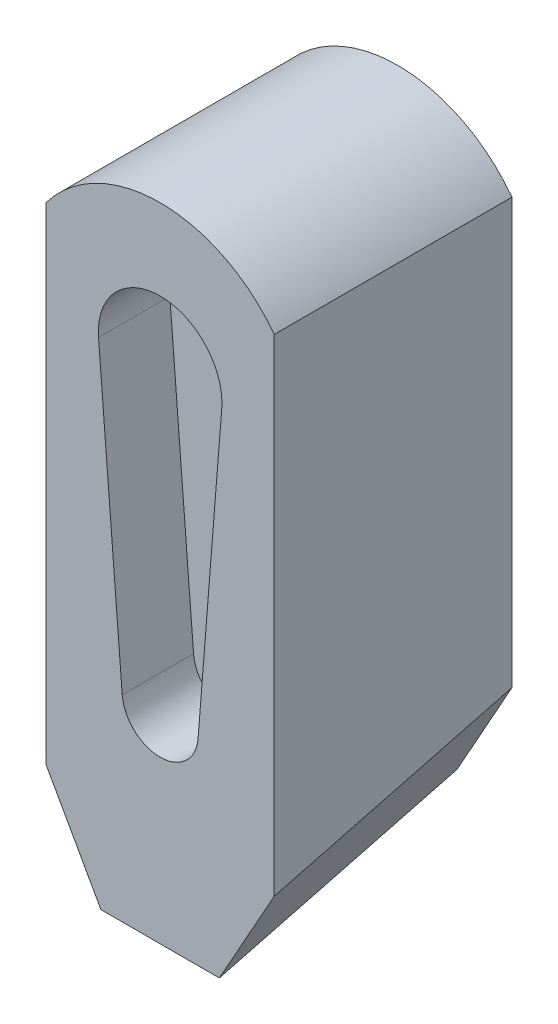
ISO-10303-21;
HEADER;
FILE_DESCRIPTION(('STEP AP214'),'2;1');
FILE_NAME('part.step','',(''),(''),'','','');
FILE_SCHEMA(('AUTOMOTIVE_DESIGN { 1 0 10303 214 1 1 1 1 }'));
ENDSEC;
DATA;
#1=APPLICATION_CONTEXT('core data for automotive mechanical design processes');
#2=APPLICATION_PROTOCOL_DEFINITION('international standard','automotive_design',2000,#1);
#3=PRODUCT_CONTEXT('',#1,'mechanical');
#4=PRODUCT('Part','Part','',(#3));
#5=PRODUCT_RELATED_PRODUCT_CATEGORY('part','',(#4));
#6=PRODUCT_DEFINITION_FORMATION('','',#4);
#7=PRODUCT_DEFINITION_CONTEXT('part definition',#1,'design');
#8=PRODUCT_DEFINITION('design','',#6,#7);
#9=PRODUCT_DEFINITION_SHAPE('','',#8);
#10=(LENGTH_UNIT() NAMED_UNIT(*) SI_UNIT(.MILLI.,.METRE.));
#11=(NAMED_UNIT(*) PLANE_ANGLE_UNIT() SI_UNIT($,.RADIAN.));
#12=(NAMED_UNIT(*) SI_UNIT($,.STERADIAN.) SOLID_ANGLE_UNIT());
#13=UNCERTAINTY_MEASURE_WITH_UNIT(LENGTH_MEASURE(1.E-05),#10,'distance_accuracy_value','');
#14=(GEOMETRIC_REPRESENTATION_CONTEXT(3) GLOBAL_UNCERTAINTY_ASSIGNED_CONTEXT((#13)) GLOBAL_UNIT_ASSIGNED_CONTEXT((#10,
#11,#12)) REPRESENTATION_CONTEXT('',''));
#15=CARTESIAN_POINT('',(0.,0.,0.));
#16=DIRECTION('',(0.,0.,1.));
#17=DIRECTION('',(1.,0.,0.));
#18=AXIS2_PLACEMENT_3D('',#15,#16,#17);
#19=CARTESIAN_POINT('',(0.,0.,0.));
#20=DIRECTION('',(0.,0.,1.));
#21=DIRECTION('',(1.,0.,0.));
#22=AXIS2_PLACEMENT_3D('',#19,#20,#21);
#23=CYLINDRICAL_SURFACE('',#22,1.5875);
#24=CARTESIAN_POINT('',(0.,0.,8.89));
#25=DIRECTION('',(0.,0.,1.));
#26=DIRECTION('',(1.,0.,0.));
#27=AXIS2_PLACEMENT_3D('',#24,#25,#26);
#28=CIRCLE('',#27,1.5875);
#29=CARTESIAN_POINT('',(1.5875,0.,8.89));
#30=VERTEX_POINT('',#29);
#31=EDGE_CURVE('E223',#30,#30,#28,.T.);
#32=CARTESIAN_POINT('',(0.,0.,6.35));
#33=DIRECTION('',(0.,0.,-1.));
#34=DIRECTION('',(-1.,0.,0.));
#35=AXIS2_PLACEMENT_3D('',#32,#33,#34);
#36=CIRCLE('',#35,1.5875);
#37=CARTESIAN_POINT('',(1.5875,0.,6.35));
#38=VERTEX_POINT('',#37);
#39=EDGE_CURVE('E219',#38,#38,#36,.F.);
#40=CARTESIAN_POINT('',(1.5875,0.,8.89));
#41=CARTESIAN_POINT('',(1.5875,0.,8.86354166666667));
#42=CARTESIAN_POINT('',(1.5875,0.,8.83708333333333));
#43=CARTESIAN_POINT('',(1.5875,0.,8.78416666666667));
#44=CARTESIAN_POINT('',(1.5875,0.,8.75770833333334));
#45=CARTESIAN_POINT('',(1.5875,0.,8.70479166666667));
#46=CARTESIAN_POINT('',(1.5875,0.,8.67833333333333));
#47=CARTESIAN_POINT('',(1.5875,0.,8.62541666666667));
#48=CARTESIAN_POINT('',(1.5875,0.,8.59895833333333));
#49=CARTESIAN_POINT('',(1.5875,0.,8.54604166666667));
#50=CARTESIAN_POINT('',(1.5875,0.,8.51958333333333));
#51=CARTESIAN_POINT('',(1.5875,0.,8.46666666666667));
#52=CARTESIAN_POINT('',(1.5875,0.,8.44020833333333));
#53=CARTESIAN_POINT('',(1.5875,0.,8.38729166666667));
#54=CARTESIAN_POINT('',(1.5875,0.,8.36083333333333));
#55=CARTESIAN_POINT('',(1.5875,0.,8.30791666666667));
#56=CARTESIAN_POINT('',(1.5875,0.,8.28145833333333));
#57=CARTESIAN_POINT('',(1.5875,0.,8.22854166666667));
#58=CARTESIAN_POINT('',(1.5875,0.,8.20208333333333));
#59=CARTESIAN_POINT('',(1.5875,0.,8.14916666666667));
#60=CARTESIAN_POINT('',(1.5875,0.,8.12270833333333));
#61=CARTESIAN_POINT('',(1.5875,0.,8.06979166666667));
#62=CARTESIAN_POINT('',(1.5875,0.,8.04333333333333));
#63=CARTESIAN_POINT('',(1.5875,0.,7.99041666666667));
#64=CARTESIAN_POINT('',(1.5875,0.,7.96395833333333));
#65=CARTESIAN_POINT('',(1.5875,0.,7.91104166666667));
#66=CARTESIAN_POINT('',(1.5875,0.,7.88458333333333));
#67=CARTESIAN_POINT('',(1.5875,0.,7.83166666666667));
#68=CARTESIAN_POINT('',(1.5875,0.,7.80520833333333));
#69=CARTESIAN_POINT('',(1.5875,0.,7.75229166666667));
#70=CARTESIAN_POINT('',(1.5875,0.,7.72583333333333));
#71=CARTESIAN_POINT('',(1.5875,0.,7.67291666666667));
#72=CARTESIAN_POINT('',(1.5875,0.,7.64645833333333));
#73=CARTESIAN_POINT('',(1.5875,0.,7.59354166666667));
#74=CARTESIAN_POINT('',(1.5875,0.,7.56708333333333));
#75=CARTESIAN_POINT('',(1.5875,0.,7.51416666666667));
#76=CARTESIAN_POINT('',(1.5875,0.,7.48770833333333));
#77=CARTESIAN_POINT('',(1.5875,0.,7.43479166666667));
#78=CARTESIAN_POINT('',(1.5875,0.,7.40833333333333));
#79=CARTESIAN_POINT('',(1.5875,0.,7.35541666666667));
#80=CARTESIAN_POINT('',(1.5875,0.,7.32895833333333));
#81=CARTESIAN_POINT('',(1.5875,0.,7.27604166666667));
#82=CARTESIAN_POINT('',(1.5875,0.,7.24958333333333));
#83=CARTESIAN_POINT('',(1.5875,0.,7.19666666666667));
#84=CARTESIAN_POINT('',(1.5875,0.,7.17020833333333));
#85=CARTESIAN_POINT('',(1.5875,0.,7.11729166666667));
#86=CARTESIAN_POINT('',(1.5875,0.,7.09083333333333));
#87=CARTESIAN_POINT('',(1.5875,0.,7.03791666666667));
#88=CARTESIAN_POINT('',(1.5875,0.,7.01145833333333));
#89=CARTESIAN_POINT('',(1.5875,0.,6.95854166666667));
#90=CARTESIAN_POINT('',(1.5875,0.,6.93208333333333));
#91=CARTESIAN_POINT('',(1.5875,0.,6.87916666666667));
#92=CARTESIAN_POINT('',(1.5875,0.,6.85270833333333));
#93=CARTESIAN_POINT('',(1.5875,0.,6.79979166666667));
#94=CARTESIAN_POINT('',(1.5875,0.,6.77333333333333));
#95=CARTESIAN_POINT('',(1.5875,0.,6.72041666666667));
#96=CARTESIAN_POINT('',(1.5875,0.,6.69395833333333));
#97=CARTESIAN_POINT('',(1.5875,0.,6.64104166666667));
#98=CARTESIAN_POINT('',(1.5875,0.,6.61458333333333));
#99=CARTESIAN_POINT('',(1.5875,0.,6.56166666666667));
#100=CARTESIAN_POINT('',(1.5875,0.,6.53520833333333));
#101=CARTESIAN_POINT('',(1.5875,0.,6.48229166666667));
#102=CARTESIAN_POINT('',(1.5875,0.,6.45583333333333));
#103=CARTESIAN_POINT('',(1.5875,0.,6.40291666666667));
#104=CARTESIAN_POINT('',(1.5875,0.,6.37645833333333));
#105=CARTESIAN_POINT('',(1.5875,0.,6.35));
#106=B_SPLINE_CURVE_WITH_KNOTS('',3,(#40,#41,#42,#43,#44,#45,#46,#47,#48,#49,#50,#51,#52,#53,
#54,#55,#56,#57,#58,#59,#60,#61,#62,#63,#64,#65,#66,#67,#68,#69,#70,#71,#72,#73,#74,#75,#76,#77,
#78,#79,#80,#81,#82,#83,#84,#85,#86,#87,#88,#89,#90,#91,#92,#93,#94,#95,#96,#97,#98,#99,#100,
#101,#102,#103,#104,#105),.UNSPECIFIED.,.F.,.F.,(4,2,2,2,2,2,2,2,2,2,2,2,2,2,2,2,2,2,2,2,2,2,2,
2,2,2,2,2,2,2,2,2,4),(0.,0.0793749999999996,0.158749999999999,0.238125,0.3175,0.396875,
0.476250000000001,0.555625000000001,0.635,0.714375,0.793749999999999,0.873125000000001,0.9525,
1.031875,1.11125,1.190625,1.27,1.349375,1.42875,1.508125,1.5875,1.666875,1.74625,1.825625,1.905,
1.984375,2.06375,2.143125,2.2225,2.301875,2.38125,2.460625,2.54),.UNSPECIFIED.);
#107=EDGE_CURVE('BSEAM47',#30,#38,#106,.T.);
#108=ORIENTED_EDGE('',*,*,#31,.T.);
#109=ORIENTED_EDGE('',*,*,#39,.F.);
#110=ORIENTED_EDGE('',*,*,#107,.T.);
#111=ORIENTED_EDGE('',*,*,#107,.F.);
#112=EDGE_LOOP('',(#108,#110,#109,#111));
#113=FACE_BOUND('',#112,.T.);
#114=ADVANCED_FACE('F47',(#113),#23,.F.);
#115=CARTESIAN_POINT('',(0.,0.,12.7));
#116=DIRECTION('',(0.,0.,-1.));
#117=DIRECTION('',(-1.,0.,0.));
#118=AXIS2_PLACEMENT_3D('',#115,#116,#117);
#119=CYLINDRICAL_SURFACE('',#118,7.62);
#120=CARTESIAN_POINT('',(0.,0.,0.));
#121=DIRECTION('',(0.,0.,1.));
#122=DIRECTION('',(-1.,0.,0.));
#123=AXIS2_PLACEMENT_3D('',#120,#121,#122);
#124=CIRCLE('',#123,7.62);
#125=CARTESIAN_POINT('',(6.096,4.57199999999999,0.));
#126=VERTEX_POINT('',#125);
#127=CARTESIAN_POINT('',(-6.096,4.57199999999999,0.));
#128=VERTEX_POINT('',#127);
#129=EDGE_CURVE('E175',#126,#128,#124,.T.);
#130=ORIENTED_EDGE('',*,*,#129,.T.);
#131=DIRECTION('',(0.,0.,-1.));
#132=VECTOR('',#131,1.);
#133=CARTESIAN_POINT('',(-6.096,4.57199999999999,12.7));
#134=LINE('',#133,#132);
#135=CARTESIAN_POINT('',(-6.096,4.57199999999999,12.7));
#136=VERTEX_POINT('',#135);
#137=EDGE_CURVE('E201',#136,#128,#134,.T.);
#138=ORIENTED_EDGE('',*,*,#137,.F.);
#139=CARTESIAN_POINT('',(0.,0.,12.7));
#140=DIRECTION('',(0.,0.,1.));
#141=DIRECTION('',(-1.,0.,0.));
#142=AXIS2_PLACEMENT_3D('',#139,#140,#141);
#143=CIRCLE('',#142,7.62);
#144=CARTESIAN_POINT('',(6.096,4.57199999999999,12.7));
#145=VERTEX_POINT('',#144);
#146=EDGE_CURVE('E176',#145,#136,#143,.T.);
#147=ORIENTED_EDGE('',*,*,#146,.F.);
#148=DIRECTION('',(0.,0.,-1.));
#149=VECTOR('',#148,1.);
#150=CARTESIAN_POINT('',(6.096,4.57199999999999,12.7));
#151=LINE('',#150,#149);
#152=EDGE_CURVE('E188',#145,#126,#151,.T.);
#153=ORIENTED_EDGE('',*,*,#152,.T.);
#154=EDGE_LOOP('',(#130,#138,#147,#153));
#155=FACE_BOUND('',#154,.T.);
#156=ADVANCED_FACE('F272',(#155),#119,.T.);
#157=CARTESIAN_POINT('',(-6.096,4.57199999999999,12.7));
#158=DIRECTION('',(1.,0.,0.));
#159=DIRECTION('',(0.,1.,0.));
#160=AXIS2_PLACEMENT_3D('',#157,#158,#159);
#161=PLANE('',#160);
#162=DIRECTION('',(0.,-1.,0.));
#163=VECTOR('',#162,1.);
#164=CARTESIAN_POINT('',(-6.096,4.57199999999999,0.));
#165=LINE('',#164,#163);
#166=CARTESIAN_POINT('',(-6.096,-18.1191036741044,0.));
#167=VERTEX_POINT('',#166);
#168=EDGE_CURVE('E192',#128,#167,#165,.T.);
#169=ORIENTED_EDGE('',*,*,#168,.T.);
#170=DIRECTION('',(0.,-0.251633851764951,0.967822506788272));
#171=VECTOR('',#170,1.);
#172=CARTESIAN_POINT('',(-6.096,-19.7752308674639,6.36971997445939));
#173=LINE('',#172,#171);
#174=CARTESIAN_POINT('',(-6.096,-21.4211036741044,12.7));
#175=VERTEX_POINT('',#174);
#176=EDGE_CURVE('E232',#167,#175,#173,.T.);
#177=ORIENTED_EDGE('',*,*,#176,.T.);
#178=DIRECTION('',(0.,-1.,0.));
#179=VECTOR('',#178,1.);
#180=CARTESIAN_POINT('',(-6.096,4.57199999999999,12.7));
#181=LINE('',#180,#179);
#182=EDGE_CURVE('E180',#136,#175,#181,.T.);
#183=ORIENTED_EDGE('',*,*,#182,.F.);
#184=ORIENTED_EDGE('',*,*,#137,.T.);
#185=EDGE_LOOP('',(#169,#177,#183,#184));
#186=FACE_BOUND('',#185,.T.);
#187=ADVANCED_FACE('F258',(#186),#161,.F.);
#188=CARTESIAN_POINT('',(6.096,-33.528,12.7));
#189=DIRECTION('',(-1.,0.,0.));
#190=DIRECTION('',(0.,-1.,0.));
#191=AXIS2_PLACEMENT_3D('',#188,#189,#190);
#192=PLANE('',#191);
#193=DIRECTION('',(0.,1.,0.));
#194=VECTOR('',#193,1.);
#195=CARTESIAN_POINT('',(6.096,-33.528,12.7));
#196=LINE('',#195,#194);
#197=CARTESIAN_POINT('',(6.096,-21.4211036741044,12.7));
#198=VERTEX_POINT('',#197);
#199=EDGE_CURVE('E185',#198,#145,#196,.T.);
#200=ORIENTED_EDGE('',*,*,#199,.F.);
#201=DIRECTION('',(0.,0.251633851764951,-0.967822506788272));
#202=VECTOR('',#201,1.);
#203=CARTESIAN_POINT('',(6.096,-22.1877074504537,15.648476062882));
#204=LINE('',#203,#202);
#205=CARTESIAN_POINT('',(6.096,-18.1191036741044,0.));
#206=VERTEX_POINT('',#205);
#207=EDGE_CURVE('E11',#198,#206,#204,.T.);
#208=ORIENTED_EDGE('',*,*,#207,.T.);
#209=DIRECTION('',(0.,1.,0.));
#210=VECTOR('',#209,1.);
#211=CARTESIAN_POINT('',(6.096,-33.528,0.));
#212=LINE('',#211,#210);
#213=EDGE_CURVE('E181',#206,#126,#212,.T.);
#214=ORIENTED_EDGE('',*,*,#213,.T.);
#215=ORIENTED_EDGE('',*,*,#152,.F.);
#216=EDGE_LOOP('',(#200,#208,#214,#215));
#217=FACE_BOUND('',#216,.T.);
#218=ADVANCED_FACE('F269',(#217),#192,.F.);
#219=CARTESIAN_POINT('',(0.,0.,12.7));
#220=DIRECTION('',(0.,0.,-1.));
#221=DIRECTION('',(-1.,0.,0.));
#222=AXIS2_PLACEMENT_3D('',#219,#220,#221);
#223=PLANE('',#222);
#224=DIRECTION('',(-0.0793650793650793,0.996845617022704,0.));
#225=VECTOR('',#224,1.);
#226=CARTESIAN_POINT('',(-2.02559029379013,-16.1632698412698,12.7));
#227=LINE('',#226,#225);
#228=CARTESIAN_POINT('',(-2.02559029379013,-16.1632698412698,12.7));
#229=VERTEX_POINT('',#228);
#230=CARTESIAN_POINT('',(-3.29158422740897,-0.262063492063492,12.7));
#231=VERTEX_POINT('',#230);
#232=EDGE_CURVE('E205',#229,#231,#227,.T.);
#233=ORIENTED_EDGE('',*,*,#232,.T.);
#234=CARTESIAN_POINT('',(0.,0.,12.7));
#235=DIRECTION('',(0.,0.,1.));
#236=DIRECTION('',(1.,0.,0.));
#237=AXIS2_PLACEMENT_3D('',#234,#235,#236);
#238=CIRCLE('',#237,3.302);
#239=CARTESIAN_POINT('',(3.29158422740897,-0.262063492063492,12.7));
#240=VERTEX_POINT('',#239);
#241=EDGE_CURVE('E134',#231,#240,#238,.F.);
#242=ORIENTED_EDGE('',*,*,#241,.T.);
#243=DIRECTION('',(-0.0793650793650794,-0.996845617022704,0.));
#244=VECTOR('',#243,1.);
#245=CARTESIAN_POINT('',(3.29158422740897,-0.26206349206349,12.7));
#246=LINE('',#245,#244);
#247=CARTESIAN_POINT('',(2.02559029379013,-16.1632698412698,12.7));
#248=VERTEX_POINT('',#247);
#249=EDGE_CURVE('E212',#240,#248,#246,.T.);
#250=ORIENTED_EDGE('',*,*,#249,.T.);
#251=CARTESIAN_POINT('',(0.,-16.002,12.7));
#252=DIRECTION('',(0.,0.,1.));
#253=DIRECTION('',(1.,0.,0.));
#254=AXIS2_PLACEMENT_3D('',#251,#252,#253);
#255=CIRCLE('',#254,2.032);
#256=EDGE_CURVE('E208',#248,#229,#255,.F.);
#257=ORIENTED_EDGE('',*,*,#256,.T.);
#258=EDGE_LOOP('',(#233,#242,#250,#257));
#259=FACE_BOUND('',#258,.T.);
#260=ORIENTED_EDGE('',*,*,#182,.T.);
#261=DIRECTION('',(-0.487787467741959,0.872962419760374,0.));
#262=VECTOR('',#261,1.);
#263=CARTESIAN_POINT('',(-6.79684576947324,-20.166844269634,12.7));
#264=LINE('',#263,#262);
#265=CARTESIAN_POINT('',(-3.16306063251672,-26.67,12.7));
#266=VERTEX_POINT('',#265);
#267=EDGE_CURVE('E239',#175,#266,#264,.F.);
#268=ORIENTED_EDGE('',*,*,#267,.T.);
#269=DIRECTION('',(1.,0.,0.));
#270=VECTOR('',#269,1.);
#271=CARTESIAN_POINT('',(-6.09600000000001,-26.67,12.7));
#272=LINE('',#271,#270);
#273=CARTESIAN_POINT('',(3.1630606325167,-26.67,12.7));
#274=VERTEX_POINT('',#273);
#275=EDGE_CURVE('E154',#266,#274,#272,.T.);
#276=ORIENTED_EDGE('',*,*,#275,.T.);
#277=DIRECTION('',(-0.487787467741959,-0.872962419760374,0.));
#278=VECTOR('',#277,1.);
#279=CARTESIAN_POINT('',(3.1630606325167,-26.67,12.7));
#280=LINE('',#279,#278);
#281=EDGE_CURVE('E236',#274,#198,#280,.F.);
#282=ORIENTED_EDGE('',*,*,#281,.T.);
#283=ORIENTED_EDGE('',*,*,#199,.T.);
#284=ORIENTED_EDGE('',*,*,#146,.T.);
#285=EDGE_LOOP('',(#260,#268,#276,#282,#283,#284));
#286=FACE_BOUND('',#285,.T.);
#287=ADVANCED_FACE('F263',(#259,#286),#223,.F.);
#288=CARTESIAN_POINT('',(0.,0.,0.));
#289=DIRECTION('',(0.,0.,-1.));
#290=DIRECTION('',(-1.,0.,0.));
#291=AXIS2_PLACEMENT_3D('',#288,#289,#290);
#292=PLANE('',#291);
#293=CARTESIAN_POINT('',(0.,0.,0.));
#294=DIRECTION('',(0.,0.,-1.));
#295=DIRECTION('',(-1.,0.,0.));
#296=AXIS2_PLACEMENT_3D('',#293,#294,#295);
#297=CIRCLE('',#296,3.175);
#298=CARTESIAN_POINT('',(-3.175,0.,0.));
#299=VERTEX_POINT('',#298);
#300=EDGE_CURVE('E224',#299,#299,#297,.T.);
#301=ORIENTED_EDGE('',*,*,#300,.F.);
#302=EDGE_LOOP('',(#301));
#303=FACE_BOUND('',#302,.T.);
#304=DIRECTION('',(1.,0.,0.));
#305=VECTOR('',#304,1.);
#306=CARTESIAN_POINT('',(-6.09600000000001,-23.368,0.));
#307=LINE('',#306,#305);
#308=CARTESIAN_POINT('',(-3.16306063251672,-23.368,0.));
#309=VERTEX_POINT('',#308);
#310=CARTESIAN_POINT('',(3.1630606325167,-23.368,0.));
#311=VERTEX_POINT('',#310);
#312=EDGE_CURVE('E158',#309,#311,#307,.T.);
#313=ORIENTED_EDGE('',*,*,#312,.F.);
#314=DIRECTION('',(0.487787467741959,-0.872962419760374,0.));
#315=VECTOR('',#314,1.);
#316=CARTESIAN_POINT('',(-12.3610174517805,-6.90699767256105,0.));
#317=LINE('',#316,#315);
#318=EDGE_CURVE('E57',#309,#167,#317,.F.);
#319=ORIENTED_EDGE('',*,*,#318,.T.);
#320=ORIENTED_EDGE('',*,*,#168,.F.);
#321=ORIENTED_EDGE('',*,*,#129,.F.);
#322=ORIENTED_EDGE('',*,*,#213,.F.);
#323=DIRECTION('',(0.487787467741959,0.872962419760374,0.));
#324=VECTOR('',#323,1.);
#325=CARTESIAN_POINT('',(12.3610174517805,-6.90699767256104,0.));
#326=LINE('',#325,#324);
#327=EDGE_CURVE('E69',#206,#311,#326,.F.);
#328=ORIENTED_EDGE('',*,*,#327,.T.);
#329=EDGE_LOOP('',(#313,#319,#320,#321,#322,#328));
#330=FACE_BOUND('',#329,.T.);
#331=ADVANCED_FACE('F252',(#303,#330),#292,.T.);
#332=CARTESIAN_POINT('',(0.,0.,8.89));
#333=DIRECTION('',(0.,0.,1.));
#334=DIRECTION('',(1.,0.,0.));
#335=AXIS2_PLACEMENT_3D('',#332,#333,#334);
#336=CYLINDRICAL_SURFACE('',#335,3.302);
#337=DIRECTION('',(0.,0.,1.));
#338=VECTOR('',#337,1.);
#339=CARTESIAN_POINT('',(-3.29158422740897,-0.262063492063492,8.89));
#340=LINE('',#339,#338);
#341=CARTESIAN_POINT('',(-3.29158422740897,-0.262063492063492,8.89));
#342=VERTEX_POINT('',#341);
#343=EDGE_CURVE('E126',#342,#231,#340,.T.);
#344=ORIENTED_EDGE('',*,*,#343,.F.);
#345=CARTESIAN_POINT('',(0.,0.,8.89));
#346=DIRECTION('',(0.,0.,1.));
#347=DIRECTION('',(1.,0.,0.));
#348=AXIS2_PLACEMENT_3D('',#345,#346,#347);
#349=CIRCLE('',#348,3.302);
#350=CARTESIAN_POINT('',(3.29158422740897,-0.262063492063492,8.89));
#351=VERTEX_POINT('',#350);
#352=EDGE_CURVE('E131',#351,#342,#349,.T.);
#353=ORIENTED_EDGE('',*,*,#352,.F.);
#354=DIRECTION('',(0.,0.,1.));
#355=VECTOR('',#354,1.);
#356=CARTESIAN_POINT('',(3.29158422740897,-0.262063492063492,8.89));
#357=LINE('',#356,#355);
#358=EDGE_CURVE('E172',#351,#240,#357,.T.);
#359=ORIENTED_EDGE('',*,*,#358,.T.);
#360=ORIENTED_EDGE('',*,*,#241,.F.);
#361=EDGE_LOOP('',(#344,#353,#359,#360));
#362=FACE_BOUND('',#361,.T.);
#363=ADVANCED_FACE('F128',(#362),#336,.F.);
#364=CARTESIAN_POINT('',(3.29158422740897,-0.262063492063492,8.89));
#365=DIRECTION('',(0.996845617022703,-0.0793650793650793,0.));
#366=DIRECTION('',(0.0793650793650794,0.996845617022704,0.));
#367=AXIS2_PLACEMENT_3D('',#364,#365,#366);
#368=PLANE('',#367);
#369=ORIENTED_EDGE('',*,*,#358,.F.);
#370=DIRECTION('',(0.0793650793650793,0.996845617022704,0.));
#371=VECTOR('',#370,1.);
#372=CARTESIAN_POINT('',(3.29158422740897,-0.262063492063492,8.89));
#373=LINE('',#372,#371);
#374=CARTESIAN_POINT('',(2.02559029379013,-16.1632698412698,8.89));
#375=VERTEX_POINT('',#374);
#376=EDGE_CURVE('E139',#375,#351,#373,.T.);
#377=ORIENTED_EDGE('',*,*,#376,.F.);
#378=DIRECTION('',(0.,0.,1.));
#379=VECTOR('',#378,1.);
#380=CARTESIAN_POINT('',(2.02559029379013,-16.1632698412698,8.89));
#381=LINE('',#380,#379);
#382=EDGE_CURVE('E168',#375,#248,#381,.T.);
#383=ORIENTED_EDGE('',*,*,#382,.T.);
#384=ORIENTED_EDGE('',*,*,#249,.F.);
#385=EDGE_LOOP('',(#369,#377,#383,#384));
#386=FACE_BOUND('',#385,.T.);
#387=ADVANCED_FACE('F372',(#386),#368,.F.);
#388=CARTESIAN_POINT('',(0.,-16.002,8.89));
#389=DIRECTION('',(0.,0.,1.));
#390=DIRECTION('',(1.,0.,0.));
#391=AXIS2_PLACEMENT_3D('',#388,#389,#390);
#392=CYLINDRICAL_SURFACE('',#391,2.032);
#393=ORIENTED_EDGE('',*,*,#382,.F.);
#394=CARTESIAN_POINT('',(0.,-16.002,8.89));
#395=DIRECTION('',(0.,0.,1.));
#396=DIRECTION('',(-1.,0.,0.));
#397=AXIS2_PLACEMENT_3D('',#394,#395,#396);
#398=CIRCLE('',#397,2.032);
#399=CARTESIAN_POINT('',(-2.02559029379013,-16.1632698412698,8.89));
#400=VERTEX_POINT('',#399);
#401=EDGE_CURVE('E149',#400,#375,#398,.T.);
#402=ORIENTED_EDGE('',*,*,#401,.F.);
#403=DIRECTION('',(0.,0.,1.));
#404=VECTOR('',#403,1.);
#405=CARTESIAN_POINT('',(-2.02559029379013,-16.1632698412698,8.89));
#406=LINE('',#405,#404);
#407=EDGE_CURVE('E138',#400,#229,#406,.T.);
#408=ORIENTED_EDGE('',*,*,#407,.T.);
#409=ORIENTED_EDGE('',*,*,#256,.F.);
#410=EDGE_LOOP('',(#393,#402,#408,#409));
#411=FACE_BOUND('',#410,.T.);
#412=ADVANCED_FACE('F363',(#411),#392,.F.);
#413=CARTESIAN_POINT('',(-2.02559029379013,-16.1632698412698,8.89));
#414=DIRECTION('',(-0.996845617022703,-0.0793650793650794,0.));
#415=DIRECTION('',(0.0793650793650794,-0.996845617022704,0.));
#416=AXIS2_PLACEMENT_3D('',#413,#414,#415);
#417=PLANE('',#416);
#418=ORIENTED_EDGE('',*,*,#407,.F.);
#419=DIRECTION('',(0.0793650793650794,-0.996845617022704,0.));
#420=VECTOR('',#419,1.);
#421=CARTESIAN_POINT('',(-2.02559029379013,-16.1632698412698,8.89));
#422=LINE('',#421,#420);
#423=EDGE_CURVE('E142',#342,#400,#422,.T.);
#424=ORIENTED_EDGE('',*,*,#423,.F.);
#425=ORIENTED_EDGE('',*,*,#343,.T.);
#426=ORIENTED_EDGE('',*,*,#232,.F.);
#427=EDGE_LOOP('',(#418,#424,#425,#426));
#428=FACE_BOUND('',#427,.T.);
#429=ADVANCED_FACE('F143',(#428),#417,.F.);
#430=CARTESIAN_POINT('',(0.,0.,8.89));
#431=DIRECTION('',(0.,0.,1.));
#432=DIRECTION('',(1.,0.,0.));
#433=AXIS2_PLACEMENT_3D('',#430,#431,#432);
#434=PLANE('',#433);
#435=ORIENTED_EDGE('',*,*,#31,.F.);
#436=EDGE_LOOP('',(#435));
#437=FACE_BOUND('',#436,.T.);
#438=ORIENTED_EDGE('',*,*,#352,.T.);
#439=ORIENTED_EDGE('',*,*,#423,.T.);
#440=ORIENTED_EDGE('',*,*,#401,.T.);
#441=ORIENTED_EDGE('',*,*,#376,.T.);
#442=EDGE_LOOP('',(#438,#439,#440,#441));
#443=FACE_BOUND('',#442,.T.);
#444=ADVANCED_FACE('F151',(#437,#443),#434,.T.);
#445=CARTESIAN_POINT('',(-6.09600000000001,-26.67,12.7));
#446=DIRECTION('',(0.,0.967822506788272,0.251633851764951));
#447=DIRECTION('',(0.,-0.251633851764951,0.967822506788272));
#448=AXIS2_PLACEMENT_3D('',#445,#446,#447);
#449=PLANE('',#448);
#450=ORIENTED_EDGE('',*,*,#275,.F.);
#451=DIRECTION('',(0.,0.251633851764951,-0.967822506788272));
#452=VECTOR('',#451,1.);
#453=CARTESIAN_POINT('',(-3.16306063251672,-26.67,12.7));
#454=LINE('',#453,#452);
#455=EDGE_CURVE('E246',#266,#309,#454,.T.);
#456=ORIENTED_EDGE('',*,*,#455,.T.);
#457=ORIENTED_EDGE('',*,*,#312,.T.);
#458=DIRECTION('',(0.,-0.251633851764951,0.967822506788272));
#459=VECTOR('',#458,1.);
#460=CARTESIAN_POINT('',(3.1630606325167,-26.67,12.7));
#461=LINE('',#460,#459);
#462=EDGE_CURVE('E242',#311,#274,#461,.T.);
#463=ORIENTED_EDGE('',*,*,#462,.T.);
#464=EDGE_LOOP('',(#450,#456,#457,#463));
#465=FACE_BOUND('',#464,.T.);
#466=ADVANCED_FACE('F265',(#465),#449,.F.);
#467=CARTESIAN_POINT('',(0.,0.,6.35));
#468=DIRECTION('',(0.,0.,-1.));
#469=DIRECTION('',(-1.,0.,0.));
#470=AXIS2_PLACEMENT_3D('',#467,#468,#469);
#471=PLANE('',#470);
#472=CARTESIAN_POINT('',(0.,0.,6.35));
#473=DIRECTION('',(0.,0.,-1.));
#474=DIRECTION('',(-1.,0.,0.));
#475=AXIS2_PLACEMENT_3D('',#472,#473,#474);
#476=CIRCLE('',#475,2.15899999999999);
#477=CARTESIAN_POINT('',(-2.15899999999999,0.,6.35));
#478=VERTEX_POINT('',#477);
#479=EDGE_CURVE('E218',#478,#478,#476,.T.);
#480=ORIENTED_EDGE('',*,*,#479,.T.);
#481=EDGE_LOOP('',(#480));
#482=FACE_BOUND('',#481,.T.);
#483=ORIENTED_EDGE('',*,*,#39,.T.);
#484=EDGE_LOOP('',(#483));
#485=FACE_BOUND('',#484,.T.);
#486=ADVANCED_FACE('F322',(#482,#485),#471,.T.);
#487=CARTESIAN_POINT('',(0.,0.,6.35));
#488=DIRECTION('',(0.,0.,-1.));
#489=DIRECTION('',(-1.,0.,0.));
#490=AXIS2_PLACEMENT_3D('',#487,#488,#489);
#491=CYLINDRICAL_SURFACE('',#490,3.175);
#492=CARTESIAN_POINT('',(0.,0.,5.334));
#493=DIRECTION('',(0.,0.,-1.));
#494=DIRECTION('',(-1.,0.,0.));
#495=AXIS2_PLACEMENT_3D('',#492,#493,#494);
#496=CIRCLE('',#495,3.175);
#497=CARTESIAN_POINT('',(-3.175,0.,5.334));
#498=VERTEX_POINT('',#497);
#499=EDGE_CURVE('E228',#498,#498,#496,.F.);
#500=ORIENTED_EDGE('',*,*,#499,.T.);
#501=EDGE_LOOP('',(#500));
#502=FACE_BOUND('',#501,.T.);
#503=ORIENTED_EDGE('',*,*,#300,.T.);
#504=EDGE_LOOP('',(#503));
#505=FACE_BOUND('',#504,.T.);
#506=ADVANCED_FACE('F291',(#502,#505),#491,.F.);
#507=CARTESIAN_POINT('',(0.,0.,6.35));
#508=DIRECTION('',(0.,0.,-1.));
#509=DIRECTION('',(-1.,0.,0.));
#510=AXIS2_PLACEMENT_3D('',#507,#508,#509);
#511=CONICAL_SURFACE('',#510,2.15899999999999,0.785398163397454);
#512=ORIENTED_EDGE('',*,*,#499,.F.);
#513=EDGE_LOOP('',(#512));
#514=FACE_BOUND('',#513,.T.);
#515=ORIENTED_EDGE('',*,*,#479,.F.);
#516=EDGE_LOOP('',(#515));
#517=FACE_BOUND('',#516,.T.);
#518=ADVANCED_FACE('F286',(#514,#517),#511,.F.);
#519=CARTESIAN_POINT('',(-6.096,-19.7752308674639,6.36971997445939));
#520=DIRECTION('',(0.86602540378444,0.483911253394134,0.125816925882475));
#521=DIRECTION('',(0.,-0.251633851764951,0.967822506788272));
#522=AXIS2_PLACEMENT_3D('',#519,#520,#521);
#523=PLANE('',#522);
#524=ORIENTED_EDGE('',*,*,#318,.F.);
#525=ORIENTED_EDGE('',*,*,#455,.F.);
#526=ORIENTED_EDGE('',*,*,#267,.F.);
#527=ORIENTED_EDGE('',*,*,#176,.F.);
#528=EDGE_LOOP('',(#524,#525,#526,#527));
#529=FACE_BOUND('',#528,.T.);
#530=ADVANCED_FACE('F260',(#529),#523,.F.);
#531=CARTESIAN_POINT('',(3.1630606325167,-26.67,12.7));
#532=DIRECTION('',(-0.86602540378444,0.483911253394134,0.125816925882475));
#533=DIRECTION('',(0.,-0.251633851764951,0.967822506788272));
#534=AXIS2_PLACEMENT_3D('',#531,#532,#533);
#535=PLANE('',#534);
#536=ORIENTED_EDGE('',*,*,#327,.F.);
#537=ORIENTED_EDGE('',*,*,#207,.F.);
#538=ORIENTED_EDGE('',*,*,#281,.F.);
#539=ORIENTED_EDGE('',*,*,#462,.F.);
#540=EDGE_LOOP('',(#536,#537,#538,#539));
#541=FACE_BOUND('',#540,.T.);
#542=ADVANCED_FACE('F50',(#541),#535,.F.);
#543=CLOSED_SHELL('',(#114,#156,#187,#218,#287,#331,#363,#387,#412,#429,#444,#466,#486,#506,
#518,#530,#542));
#544=MANIFOLD_SOLID_BREP('B2',#543);
#545=ADVANCED_BREP_SHAPE_REPRESENTATION('',(#18,#544),#14);
#546=SHAPE_DEFINITION_REPRESENTATION(#9,#545);
ENDSEC;
END-ISO-10303-21;
